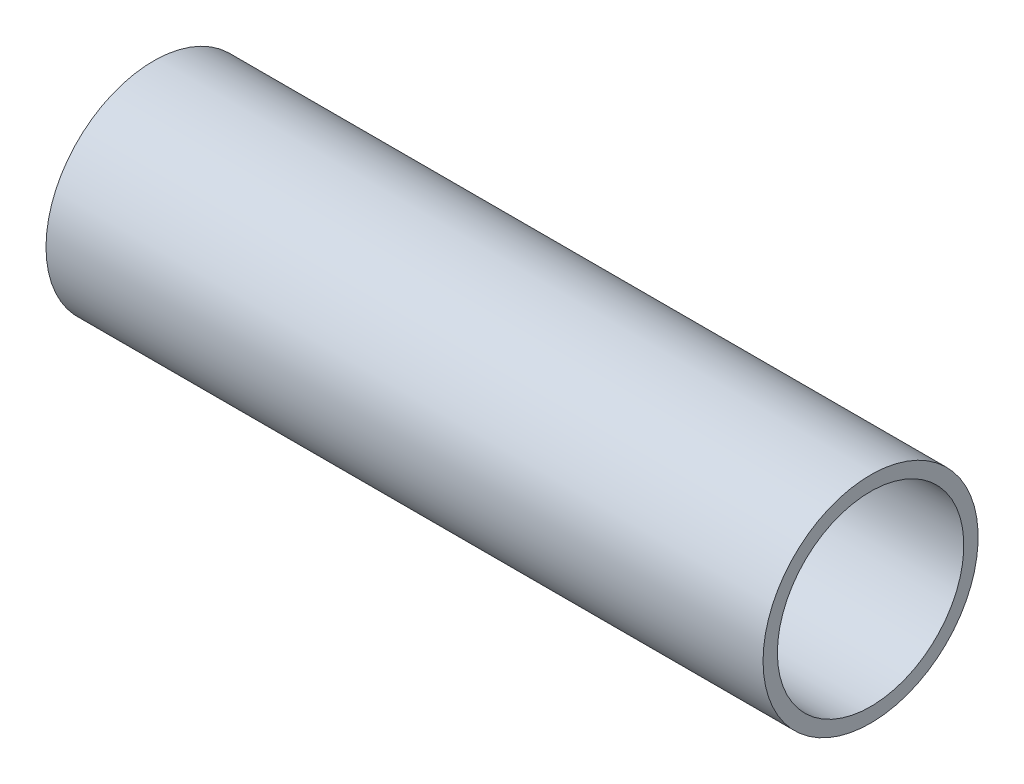
ISO-10303-21;
HEADER;
FILE_DESCRIPTION(('STEP AP214'),'2;1');
FILE_NAME('part.step','',(''),(''),'','','');
FILE_SCHEMA(('AUTOMOTIVE_DESIGN { 1 0 10303 214 1 1 1 1 }'));
ENDSEC;
DATA;
#1=APPLICATION_CONTEXT('core data for automotive mechanical design processes');
#2=APPLICATION_PROTOCOL_DEFINITION('international standard','automotive_design',2000,#1);
#3=PRODUCT_CONTEXT('',#1,'mechanical');
#4=PRODUCT('Part','Part','',(#3));
#5=PRODUCT_RELATED_PRODUCT_CATEGORY('part','',(#4));
#6=PRODUCT_DEFINITION_FORMATION('','',#4);
#7=PRODUCT_DEFINITION_CONTEXT('part definition',#1,'design');
#8=PRODUCT_DEFINITION('design','',#6,#7);
#9=PRODUCT_DEFINITION_SHAPE('','',#8);
#10=(LENGTH_UNIT() NAMED_UNIT(*) SI_UNIT(.MILLI.,.METRE.));
#11=(NAMED_UNIT(*) PLANE_ANGLE_UNIT() SI_UNIT($,.RADIAN.));
#12=(NAMED_UNIT(*) SI_UNIT($,.STERADIAN.) SOLID_ANGLE_UNIT());
#13=UNCERTAINTY_MEASURE_WITH_UNIT(LENGTH_MEASURE(1.E-05),#10,'distance_accuracy_value','');
#14=(GEOMETRIC_REPRESENTATION_CONTEXT(3) GLOBAL_UNCERTAINTY_ASSIGNED_CONTEXT((#13)) GLOBAL_UNIT_ASSIGNED_CONTEXT((#10,
#11,#12)) REPRESENTATION_CONTEXT('',''));
#15=CARTESIAN_POINT('',(0.,0.,0.));
#16=DIRECTION('',(0.,0.,1.));
#17=DIRECTION('',(1.,0.,0.));
#18=AXIS2_PLACEMENT_3D('',#15,#16,#17);
#19=CARTESIAN_POINT('',(0.,15.,0.));
#20=DIRECTION('',(1.,0.,0.));
#21=DIRECTION('',(0.,0.,-1.));
#22=AXIS2_PLACEMENT_3D('',#19,#20,#21);
#23=PLANE('',#22);
#24=CARTESIAN_POINT('',(0.,0.,0.));
#25=DIRECTION('',(-1.,0.,0.));
#26=DIRECTION('',(0.,0.,1.));
#27=AXIS2_PLACEMENT_3D('',#24,#25,#26);
#28=CIRCLE('',#27,13.);
#29=CARTESIAN_POINT('',(0.,0.,13.));
#30=VERTEX_POINT('',#29);
#31=EDGE_CURVE('E10',#30,#30,#28,.T.);
#32=ORIENTED_EDGE('',*,*,#31,.F.);
#33=EDGE_LOOP('',(#32));
#34=FACE_BOUND('',#33,.T.);
#35=CARTESIAN_POINT('',(0.,0.,0.));
#36=DIRECTION('',(-1.,0.,0.));
#37=DIRECTION('',(0.,0.,1.));
#38=AXIS2_PLACEMENT_3D('',#35,#36,#37);
#39=CIRCLE('',#38,15.);
#40=CARTESIAN_POINT('',(0.,0.,15.));
#41=VERTEX_POINT('',#40);
#42=EDGE_CURVE('E47',#41,#41,#39,.T.);
#43=ORIENTED_EDGE('',*,*,#42,.T.);
#44=EDGE_LOOP('',(#43));
#45=FACE_BOUND('',#44,.T.);
#46=ADVANCED_FACE('F33',(#34,#45),#23,.F.);
#47=CARTESIAN_POINT('',(0.,0.,0.));
#48=DIRECTION('',(-1.,0.,0.));
#49=DIRECTION('',(0.,0.,1.));
#50=AXIS2_PLACEMENT_3D('',#47,#48,#49);
#51=CYLINDRICAL_SURFACE('',#50,13.);
#52=CARTESIAN_POINT('',(100.,0.,0.));
#53=DIRECTION('',(-1.,0.,0.));
#54=DIRECTION('',(0.,0.,1.));
#55=AXIS2_PLACEMENT_3D('',#52,#53,#54);
#56=CIRCLE('',#55,13.);
#57=CARTESIAN_POINT('',(100.,0.,13.));
#58=VERTEX_POINT('',#57);
#59=EDGE_CURVE('E39',#58,#58,#56,.T.);
#60=ORIENTED_EDGE('',*,*,#59,.F.);
#61=EDGE_LOOP('',(#60));
#62=FACE_BOUND('',#61,.T.);
#63=ORIENTED_EDGE('',*,*,#31,.T.);
#64=EDGE_LOOP('',(#63));
#65=FACE_BOUND('',#64,.T.);
#66=ADVANCED_FACE('F62',(#62,#65),#51,.F.);
#67=CARTESIAN_POINT('',(100.,15.,0.));
#68=DIRECTION('',(-1.,0.,0.));
#69=DIRECTION('',(0.,0.,1.));
#70=AXIS2_PLACEMENT_3D('',#67,#68,#69);
#71=PLANE('',#70);
#72=CARTESIAN_POINT('',(100.,0.,0.));
#73=DIRECTION('',(-1.,0.,0.));
#74=DIRECTION('',(0.,0.,1.));
#75=AXIS2_PLACEMENT_3D('',#72,#73,#74);
#76=CIRCLE('',#75,15.);
#77=CARTESIAN_POINT('',(100.,0.,15.));
#78=VERTEX_POINT('',#77);
#79=EDGE_CURVE('E43',#78,#78,#76,.T.);
#80=ORIENTED_EDGE('',*,*,#79,.F.);
#81=EDGE_LOOP('',(#80));
#82=FACE_BOUND('',#81,.T.);
#83=ORIENTED_EDGE('',*,*,#59,.T.);
#84=EDGE_LOOP('',(#83));
#85=FACE_BOUND('',#84,.T.);
#86=ADVANCED_FACE('F57',(#82,#85),#71,.F.);
#87=CARTESIAN_POINT('',(0.,0.,0.));
#88=DIRECTION('',(-1.,0.,0.));
#89=DIRECTION('',(0.,0.,1.));
#90=AXIS2_PLACEMENT_3D('',#87,#88,#89);
#91=CYLINDRICAL_SURFACE('',#90,15.);
#92=ORIENTED_EDGE('',*,*,#42,.F.);
#93=EDGE_LOOP('',(#92));
#94=FACE_BOUND('',#93,.T.);
#95=ORIENTED_EDGE('',*,*,#79,.T.);
#96=EDGE_LOOP('',(#95));
#97=FACE_BOUND('',#96,.T.);
#98=ADVANCED_FACE('F54',(#94,#97),#91,.T.);
#99=CLOSED_SHELL('',(#46,#66,#86,#98));
#100=MANIFOLD_SOLID_BREP('B2',#99);
#101=ADVANCED_BREP_SHAPE_REPRESENTATION('',(#18,#100),#14);
#102=SHAPE_DEFINITION_REPRESENTATION(#9,#101);
ENDSEC;
END-ISO-10303-21;
